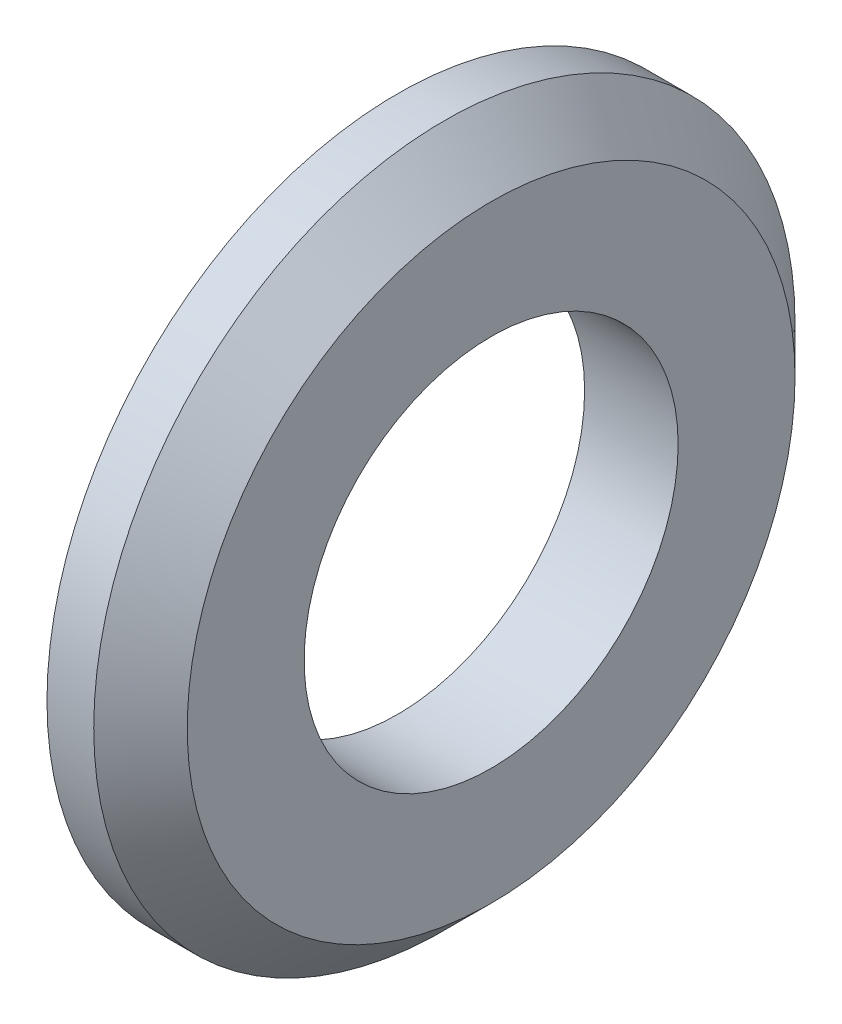
ISO-10303-21;
HEADER;
FILE_DESCRIPTION(('STEP AP214'),'2;1');
FILE_NAME('part.step','',(''),(''),'','','');
FILE_SCHEMA(('AUTOMOTIVE_DESIGN { 1 0 10303 214 1 1 1 1 }'));
ENDSEC;
DATA;
#1=APPLICATION_CONTEXT('core data for automotive mechanical design processes');
#2=APPLICATION_PROTOCOL_DEFINITION('international standard','automotive_design',2000,#1);
#3=PRODUCT_CONTEXT('',#1,'mechanical');
#4=PRODUCT('Part','Part','',(#3));
#5=PRODUCT_RELATED_PRODUCT_CATEGORY('part','',(#4));
#6=PRODUCT_DEFINITION_FORMATION('','',#4);
#7=PRODUCT_DEFINITION_CONTEXT('part definition',#1,'design');
#8=PRODUCT_DEFINITION('design','',#6,#7);
#9=PRODUCT_DEFINITION_SHAPE('','',#8);
#10=(LENGTH_UNIT() NAMED_UNIT(*) SI_UNIT(.MILLI.,.METRE.));
#11=(NAMED_UNIT(*) PLANE_ANGLE_UNIT() SI_UNIT($,.RADIAN.));
#12=(NAMED_UNIT(*) SI_UNIT($,.STERADIAN.) SOLID_ANGLE_UNIT());
#13=UNCERTAINTY_MEASURE_WITH_UNIT(LENGTH_MEASURE(1.E-05),#10,'distance_accuracy_value','');
#14=(GEOMETRIC_REPRESENTATION_CONTEXT(3) GLOBAL_UNCERTAINTY_ASSIGNED_CONTEXT((#13)) GLOBAL_UNIT_ASSIGNED_CONTEXT((#10,
#11,#12)) REPRESENTATION_CONTEXT('',''));
#15=CARTESIAN_POINT('',(0.,0.,0.));
#16=DIRECTION('',(0.,0.,1.));
#17=DIRECTION('',(1.,0.,0.));
#18=AXIS2_PLACEMENT_3D('',#15,#16,#17);
#19=CARTESIAN_POINT('',(1.6,0.,0.));
#20=DIRECTION('',(1.,0.,0.));
#21=DIRECTION('',(0.,0.,-1.));
#22=AXIS2_PLACEMENT_3D('',#19,#20,#21);
#23=PLANE('',#22);
#24=CARTESIAN_POINT('',(1.6,0.,0.));
#25=DIRECTION('',(1.,0.,0.));
#26=DIRECTION('',(0.,0.,-1.));
#27=AXIS2_PLACEMENT_3D('',#24,#25,#26);
#28=CIRCLE('',#27,5.2);
#29=CARTESIAN_POINT('',(1.6,0.,-5.2));
#30=VERTEX_POINT('',#29);
#31=EDGE_CURVE('E39',#30,#30,#28,.T.);
#32=ORIENTED_EDGE('',*,*,#31,.T.);
#33=EDGE_LOOP('',(#32));
#34=FACE_BOUND('',#33,.T.);
#35=CARTESIAN_POINT('',(1.6,0.,0.));
#36=DIRECTION('',(1.,0.,0.));
#37=DIRECTION('',(0.,0.,-1.));
#38=AXIS2_PLACEMENT_3D('',#35,#36,#37);
#39=CIRCLE('',#38,3.2);
#40=CARTESIAN_POINT('',(1.6,0.,-3.2));
#41=VERTEX_POINT('',#40);
#42=EDGE_CURVE('E47',#41,#41,#39,.T.);
#43=ORIENTED_EDGE('',*,*,#42,.F.);
#44=EDGE_LOOP('',(#43));
#45=FACE_BOUND('',#44,.T.);
#46=ADVANCED_FACE('F32',(#34,#45),#23,.T.);
#47=CARTESIAN_POINT('',(0.,0.,0.));
#48=DIRECTION('',(1.,0.,0.));
#49=DIRECTION('',(0.,0.,-1.));
#50=AXIS2_PLACEMENT_3D('',#47,#48,#49);
#51=PLANE('',#50);
#52=CARTESIAN_POINT('',(0.,0.,0.));
#53=DIRECTION('',(1.,0.,0.));
#54=DIRECTION('',(0.,0.,-1.));
#55=AXIS2_PLACEMENT_3D('',#52,#53,#54);
#56=CIRCLE('',#55,6.);
#57=CARTESIAN_POINT('',(0.,0.,-6.));
#58=VERTEX_POINT('',#57);
#59=EDGE_CURVE('E43',#58,#58,#56,.T.);
#60=ORIENTED_EDGE('',*,*,#59,.F.);
#61=EDGE_LOOP('',(#60));
#62=FACE_BOUND('',#61,.T.);
#63=CARTESIAN_POINT('',(0.,0.,0.));
#64=DIRECTION('',(1.,0.,0.));
#65=DIRECTION('',(0.,0.,-1.));
#66=AXIS2_PLACEMENT_3D('',#63,#64,#65);
#67=CIRCLE('',#66,3.2);
#68=CARTESIAN_POINT('',(0.,0.,-3.2));
#69=VERTEX_POINT('',#68);
#70=EDGE_CURVE('E50',#69,#69,#67,.T.);
#71=ORIENTED_EDGE('',*,*,#70,.T.);
#72=EDGE_LOOP('',(#71));
#73=FACE_BOUND('',#72,.T.);
#74=ADVANCED_FACE('F60',(#62,#73),#51,.F.);
#75=CARTESIAN_POINT('',(1.6,0.,0.));
#76=DIRECTION('',(-1.,0.,0.));
#77=DIRECTION('',(0.,0.,1.));
#78=AXIS2_PLACEMENT_3D('',#75,#76,#77);
#79=CYLINDRICAL_SURFACE('',#78,6.);
#80=CARTESIAN_POINT('',(0.799999999999993,0.,0.));
#81=DIRECTION('',(1.,0.,0.));
#82=DIRECTION('',(0.,0.,-1.));
#83=AXIS2_PLACEMENT_3D('',#80,#81,#82);
#84=CIRCLE('',#83,6.);
#85=CARTESIAN_POINT('',(0.799999999999993,0.,-6.));
#86=VERTEX_POINT('',#85);
#87=EDGE_CURVE('E10',#86,#86,#84,.F.);
#88=ORIENTED_EDGE('',*,*,#87,.T.);
#89=EDGE_LOOP('',(#88));
#90=FACE_BOUND('',#89,.T.);
#91=ORIENTED_EDGE('',*,*,#59,.T.);
#92=EDGE_LOOP('',(#91));
#93=FACE_BOUND('',#92,.T.);
#94=ADVANCED_FACE('F65',(#90,#93),#79,.T.);
#95=CARTESIAN_POINT('',(1.6,0.,0.));
#96=DIRECTION('',(-1.,0.,0.));
#97=DIRECTION('',(0.,0.,1.));
#98=AXIS2_PLACEMENT_3D('',#95,#96,#97);
#99=CYLINDRICAL_SURFACE('',#98,3.2);
#100=ORIENTED_EDGE('',*,*,#42,.T.);
#101=EDGE_LOOP('',(#100));
#102=FACE_BOUND('',#101,.T.);
#103=ORIENTED_EDGE('',*,*,#70,.F.);
#104=EDGE_LOOP('',(#103));
#105=FACE_BOUND('',#104,.T.);
#106=ADVANCED_FACE('F56',(#102,#105),#99,.F.);
#107=CARTESIAN_POINT('',(1.6,0.,0.));
#108=DIRECTION('',(-1.,0.,0.));
#109=DIRECTION('',(0.,0.,1.));
#110=AXIS2_PLACEMENT_3D('',#107,#108,#109);
#111=CONICAL_SURFACE('',#110,5.2,0.785398163397446);
#112=ORIENTED_EDGE('',*,*,#87,.F.);
#113=EDGE_LOOP('',(#112));
#114=FACE_BOUND('',#113,.T.);
#115=ORIENTED_EDGE('',*,*,#31,.F.);
#116=EDGE_LOOP('',(#115));
#117=FACE_BOUND('',#116,.T.);
#118=ADVANCED_FACE('F34',(#114,#117),#111,.T.);
#119=CLOSED_SHELL('',(#46,#74,#94,#106,#118));
#120=MANIFOLD_SOLID_BREP('B2',#119);
#121=ADVANCED_BREP_SHAPE_REPRESENTATION('',(#18,#120),#14);
#122=SHAPE_DEFINITION_REPRESENTATION(#9,#121);
ENDSEC;
END-ISO-10303-21;
